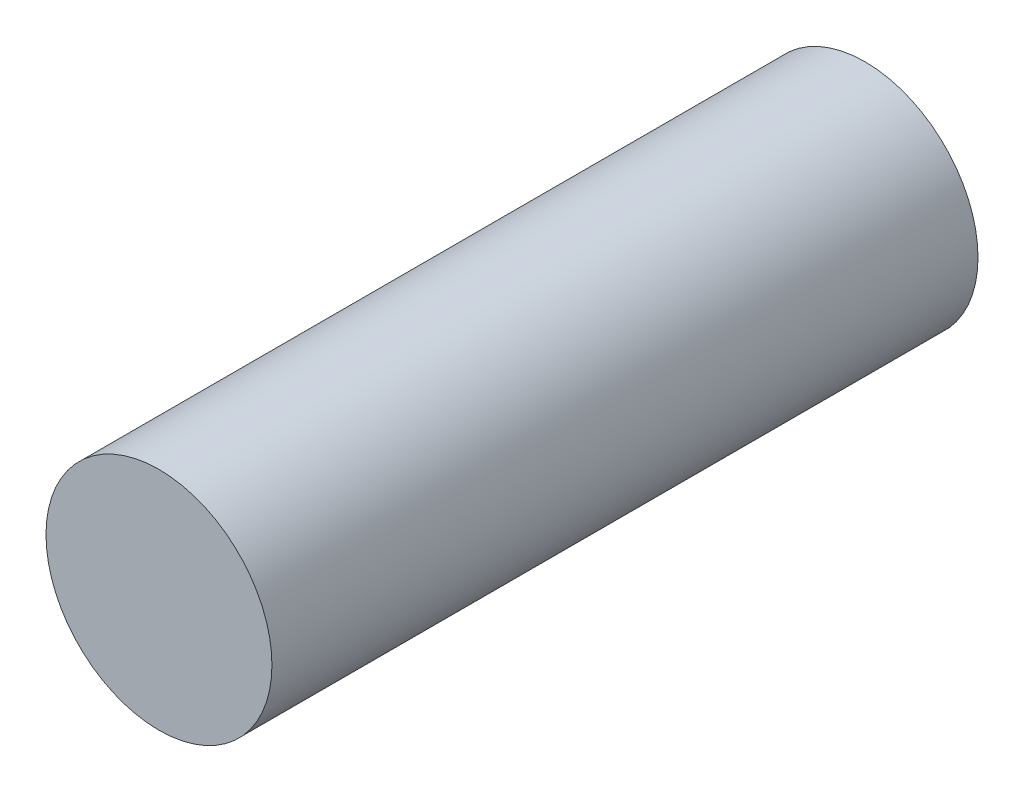
ISO-10303-21;
HEADER;
FILE_DESCRIPTION(('STEP AP214'),'2;1');
FILE_NAME('part.step','',(''),(''),'','','');
FILE_SCHEMA(('AUTOMOTIVE_DESIGN { 1 0 10303 214 1 1 1 1 }'));
ENDSEC;
DATA;
#1=APPLICATION_CONTEXT('core data for automotive mechanical design processes');
#2=APPLICATION_PROTOCOL_DEFINITION('international standard','automotive_design',2000,#1);
#3=PRODUCT_CONTEXT('',#1,'mechanical');
#4=PRODUCT('Part','Part','',(#3));
#5=PRODUCT_RELATED_PRODUCT_CATEGORY('part','',(#4));
#6=PRODUCT_DEFINITION_FORMATION('','',#4);
#7=PRODUCT_DEFINITION_CONTEXT('part definition',#1,'design');
#8=PRODUCT_DEFINITION('design','',#6,#7);
#9=PRODUCT_DEFINITION_SHAPE('','',#8);
#10=(LENGTH_UNIT() NAMED_UNIT(*) SI_UNIT(.MILLI.,.METRE.));
#11=(NAMED_UNIT(*) PLANE_ANGLE_UNIT() SI_UNIT($,.RADIAN.));
#12=(NAMED_UNIT(*) SI_UNIT($,.STERADIAN.) SOLID_ANGLE_UNIT());
#13=UNCERTAINTY_MEASURE_WITH_UNIT(LENGTH_MEASURE(1.E-05),#10,'distance_accuracy_value','');
#14=(GEOMETRIC_REPRESENTATION_CONTEXT(3) GLOBAL_UNCERTAINTY_ASSIGNED_CONTEXT((#13)) GLOBAL_UNIT_ASSIGNED_CONTEXT((#10,
#11,#12)) REPRESENTATION_CONTEXT('',''));
#15=CARTESIAN_POINT('',(0.,0.,0.));
#16=DIRECTION('',(0.,0.,1.));
#17=DIRECTION('',(1.,0.,0.));
#18=AXIS2_PLACEMENT_3D('',#15,#16,#17);
#19=CARTESIAN_POINT('',(0.,0.,12.5));
#20=DIRECTION('',(0.,0.,-1.));
#21=DIRECTION('',(-1.,0.,0.));
#22=AXIS2_PLACEMENT_3D('',#19,#20,#21);
#23=CYLINDRICAL_SURFACE('',#22,4.);
#24=CARTESIAN_POINT('',(0.,0.,12.5));
#25=DIRECTION('',(0.,0.,1.));
#26=DIRECTION('',(1.,0.,0.));
#27=AXIS2_PLACEMENT_3D('',#24,#25,#26);
#28=CIRCLE('',#27,4.);
#29=CARTESIAN_POINT('',(4.,0.,12.5));
#30=VERTEX_POINT('',#29);
#31=EDGE_CURVE('E10',#30,#30,#28,.T.);
#32=ORIENTED_EDGE('',*,*,#31,.F.);
#33=EDGE_LOOP('',(#32));
#34=FACE_BOUND('',#33,.T.);
#35=CARTESIAN_POINT('',(0.,0.,-12.5));
#36=DIRECTION('',(0.,0.,1.));
#37=DIRECTION('',(1.,0.,0.));
#38=AXIS2_PLACEMENT_3D('',#35,#36,#37);
#39=CIRCLE('',#38,4.);
#40=CARTESIAN_POINT('',(4.,0.,-12.5));
#41=VERTEX_POINT('',#40);
#42=EDGE_CURVE('E46',#41,#41,#39,.T.);
#43=ORIENTED_EDGE('',*,*,#42,.T.);
#44=EDGE_LOOP('',(#43));
#45=FACE_BOUND('',#44,.T.);
#46=ADVANCED_FACE('F43',(#34,#45),#23,.T.);
#47=CARTESIAN_POINT('',(0.,0.,12.5));
#48=DIRECTION('',(0.,0.,1.));
#49=DIRECTION('',(1.,0.,0.));
#50=AXIS2_PLACEMENT_3D('',#47,#48,#49);
#51=PLANE('',#50);
#52=ORIENTED_EDGE('',*,*,#31,.T.);
#53=EDGE_LOOP('',(#52));
#54=FACE_BOUND('',#53,.T.);
#55=ADVANCED_FACE('F60',(#54),#51,.T.);
#56=CARTESIAN_POINT('',(0.,0.,-12.5));
#57=DIRECTION('',(0.,0.,1.));
#58=DIRECTION('',(1.,0.,0.));
#59=AXIS2_PLACEMENT_3D('',#56,#57,#58);
#60=PLANE('',#59);
#61=ORIENTED_EDGE('',*,*,#42,.F.);
#62=EDGE_LOOP('',(#61));
#63=FACE_BOUND('',#62,.T.);
#64=ADVANCED_FACE('F58',(#63),#60,.F.);
#65=CLOSED_SHELL('',(#46,#55,#64));
#66=MANIFOLD_SOLID_BREP('B2',#65);
#67=ADVANCED_BREP_SHAPE_REPRESENTATION('',(#18,#66),#14);
#68=SHAPE_DEFINITION_REPRESENTATION(#9,#67);
ENDSEC;
END-ISO-10303-21;
